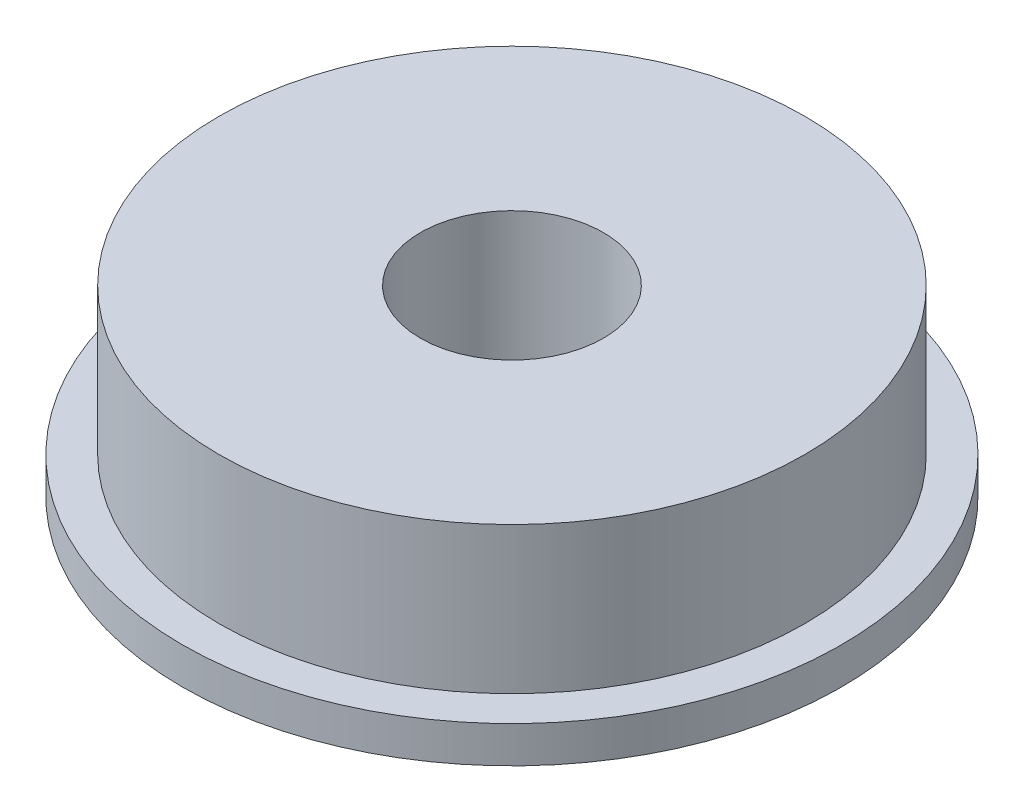
ISO-10303-21;
HEADER;
FILE_DESCRIPTION(('STEP AP214'),'2;1');
FILE_NAME('part.step','',(''),(''),'','','');
FILE_SCHEMA(('AUTOMOTIVE_DESIGN { 1 0 10303 214 1 1 1 1 }'));
ENDSEC;
DATA;
#1=APPLICATION_CONTEXT('core data for automotive mechanical design processes');
#2=APPLICATION_PROTOCOL_DEFINITION('international standard','automotive_design',2000,#1);
#3=PRODUCT_CONTEXT('',#1,'mechanical');
#4=PRODUCT('Part','Part','',(#3));
#5=PRODUCT_RELATED_PRODUCT_CATEGORY('part','',(#4));
#6=PRODUCT_DEFINITION_FORMATION('','',#4);
#7=PRODUCT_DEFINITION_CONTEXT('part definition',#1,'design');
#8=PRODUCT_DEFINITION('design','',#6,#7);
#9=PRODUCT_DEFINITION_SHAPE('','',#8);
#10=(LENGTH_UNIT() NAMED_UNIT(*) SI_UNIT(.MILLI.,.METRE.));
#11=(NAMED_UNIT(*) PLANE_ANGLE_UNIT() SI_UNIT($,.RADIAN.));
#12=(NAMED_UNIT(*) SI_UNIT($,.STERADIAN.) SOLID_ANGLE_UNIT());
#13=UNCERTAINTY_MEASURE_WITH_UNIT(LENGTH_MEASURE(1.E-05),#10,'distance_accuracy_value','');
#14=(GEOMETRIC_REPRESENTATION_CONTEXT(3) GLOBAL_UNCERTAINTY_ASSIGNED_CONTEXT((#13)) GLOBAL_UNIT_ASSIGNED_CONTEXT((#10,
#11,#12)) REPRESENTATION_CONTEXT('',''));
#15=CARTESIAN_POINT('',(0.,0.,0.));
#16=DIRECTION('',(0.,0.,1.));
#17=DIRECTION('',(1.,0.,0.));
#18=AXIS2_PLACEMENT_3D('',#15,#16,#17);
#19=CARTESIAN_POINT('',(0.,1.,0.));
#20=DIRECTION('',(0.,-1.,0.));
#21=DIRECTION('',(0.,0.,-1.));
#22=AXIS2_PLACEMENT_3D('',#19,#20,#21);
#23=CYLINDRICAL_SURFACE('',#22,9.);
#24=CARTESIAN_POINT('',(0.,1.,0.));
#25=DIRECTION('',(0.,1.,0.));
#26=DIRECTION('',(0.,0.,1.));
#27=AXIS2_PLACEMENT_3D('',#24,#25,#26);
#28=CIRCLE('',#27,9.);
#29=CARTESIAN_POINT('',(0.,1.,9.));
#30=VERTEX_POINT('',#29);
#31=EDGE_CURVE('E10',#30,#30,#28,.T.);
#32=ORIENTED_EDGE('',*,*,#31,.F.);
#33=EDGE_LOOP('',(#32));
#34=FACE_BOUND('',#33,.T.);
#35=CARTESIAN_POINT('',(0.,0.,0.));
#36=DIRECTION('',(0.,1.,0.));
#37=DIRECTION('',(0.,0.,1.));
#38=AXIS2_PLACEMENT_3D('',#35,#36,#37);
#39=CIRCLE('',#38,9.);
#40=CARTESIAN_POINT('',(0.,0.,9.));
#41=VERTEX_POINT('',#40);
#42=EDGE_CURVE('E40',#41,#41,#39,.T.);
#43=ORIENTED_EDGE('',*,*,#42,.T.);
#44=EDGE_LOOP('',(#43));
#45=FACE_BOUND('',#44,.T.);
#46=ADVANCED_FACE('F37',(#34,#45),#23,.T.);
#47=CARTESIAN_POINT('',(0.,1.,0.));
#48=DIRECTION('',(0.,1.,0.));
#49=DIRECTION('',(0.,0.,1.));
#50=AXIS2_PLACEMENT_3D('',#47,#48,#49);
#51=PLANE('',#50);
#52=CARTESIAN_POINT('',(0.,1.,0.));
#53=DIRECTION('',(0.,1.,0.));
#54=DIRECTION('',(0.,0.,1.));
#55=AXIS2_PLACEMENT_3D('',#52,#53,#54);
#56=CIRCLE('',#55,8.);
#57=CARTESIAN_POINT('',(0.,1.,8.));
#58=VERTEX_POINT('',#57);
#59=EDGE_CURVE('E44',#58,#58,#56,.T.);
#60=ORIENTED_EDGE('',*,*,#59,.F.);
#61=EDGE_LOOP('',(#60));
#62=FACE_BOUND('',#61,.T.);
#63=ORIENTED_EDGE('',*,*,#31,.T.);
#64=EDGE_LOOP('',(#63));
#65=FACE_BOUND('',#64,.T.);
#66=ADVANCED_FACE('F79',(#62,#65),#51,.T.);
#67=CARTESIAN_POINT('',(0.,0.,0.));
#68=DIRECTION('',(0.,1.,0.));
#69=DIRECTION('',(0.,0.,1.));
#70=AXIS2_PLACEMENT_3D('',#67,#68,#69);
#71=PLANE('',#70);
#72=ORIENTED_EDGE('',*,*,#42,.F.);
#73=EDGE_LOOP('',(#72));
#74=FACE_BOUND('',#73,.T.);
#75=CARTESIAN_POINT('',(0.,0.,0.));
#76=DIRECTION('',(0.,1.,0.));
#77=DIRECTION('',(0.,0.,1.));
#78=AXIS2_PLACEMENT_3D('',#75,#76,#77);
#79=CIRCLE('',#78,2.5);
#80=CARTESIAN_POINT('',(0.,0.,2.5));
#81=VERTEX_POINT('',#80);
#82=EDGE_CURVE('E50',#81,#81,#79,.T.);
#83=ORIENTED_EDGE('',*,*,#82,.T.);
#84=EDGE_LOOP('',(#83));
#85=FACE_BOUND('',#84,.T.);
#86=ADVANCED_FACE('F76',(#74,#85),#71,.F.);
#87=CARTESIAN_POINT('',(0.,5.,0.));
#88=DIRECTION('',(0.,-1.,0.));
#89=DIRECTION('',(0.,0.,-1.));
#90=AXIS2_PLACEMENT_3D('',#87,#88,#89);
#91=CYLINDRICAL_SURFACE('',#90,2.5);
#92=CARTESIAN_POINT('',(0.,5.,0.));
#93=DIRECTION('',(0.,1.,0.));
#94=DIRECTION('',(0.,0.,1.));
#95=AXIS2_PLACEMENT_3D('',#92,#93,#94);
#96=CIRCLE('',#95,2.5);
#97=CARTESIAN_POINT('',(0.,5.,2.5));
#98=VERTEX_POINT('',#97);
#99=EDGE_CURVE('E53',#98,#98,#96,.T.);
#100=ORIENTED_EDGE('',*,*,#99,.T.);
#101=EDGE_LOOP('',(#100));
#102=FACE_BOUND('',#101,.T.);
#103=ORIENTED_EDGE('',*,*,#82,.F.);
#104=EDGE_LOOP('',(#103));
#105=FACE_BOUND('',#104,.T.);
#106=ADVANCED_FACE('F60',(#102,#105),#91,.F.);
#107=CARTESIAN_POINT('',(0.,5.,0.));
#108=DIRECTION('',(0.,-1.,0.));
#109=DIRECTION('',(0.,0.,-1.));
#110=AXIS2_PLACEMENT_3D('',#107,#108,#109);
#111=CYLINDRICAL_SURFACE('',#110,8.);
#112=ORIENTED_EDGE('',*,*,#59,.T.);
#113=EDGE_LOOP('',(#112));
#114=FACE_BOUND('',#113,.T.);
#115=CARTESIAN_POINT('',(0.,5.,0.));
#116=DIRECTION('',(0.,1.,0.));
#117=DIRECTION('',(0.,0.,1.));
#118=AXIS2_PLACEMENT_3D('',#115,#116,#117);
#119=CIRCLE('',#118,8.);
#120=CARTESIAN_POINT('',(0.,5.,8.));
#121=VERTEX_POINT('',#120);
#122=EDGE_CURVE('E54',#121,#121,#119,.T.);
#123=ORIENTED_EDGE('',*,*,#122,.F.);
#124=EDGE_LOOP('',(#123));
#125=FACE_BOUND('',#124,.T.);
#126=ADVANCED_FACE('F66',(#114,#125),#111,.T.);
#127=CARTESIAN_POINT('',(0.,5.,0.));
#128=DIRECTION('',(0.,1.,0.));
#129=DIRECTION('',(0.,0.,1.));
#130=AXIS2_PLACEMENT_3D('',#127,#128,#129);
#131=PLANE('',#130);
#132=ORIENTED_EDGE('',*,*,#99,.F.);
#133=EDGE_LOOP('',(#132));
#134=FACE_BOUND('',#133,.T.);
#135=ORIENTED_EDGE('',*,*,#122,.T.);
#136=EDGE_LOOP('',(#135));
#137=FACE_BOUND('',#136,.T.);
#138=ADVANCED_FACE('F63',(#134,#137),#131,.T.);
#139=CLOSED_SHELL('',(#46,#66,#86,#106,#126,#138));
#140=MANIFOLD_SOLID_BREP('B2',#139);
#141=ADVANCED_BREP_SHAPE_REPRESENTATION('',(#18,#140),#14);
#142=SHAPE_DEFINITION_REPRESENTATION(#9,#141);
ENDSEC;
END-ISO-10303-21;
